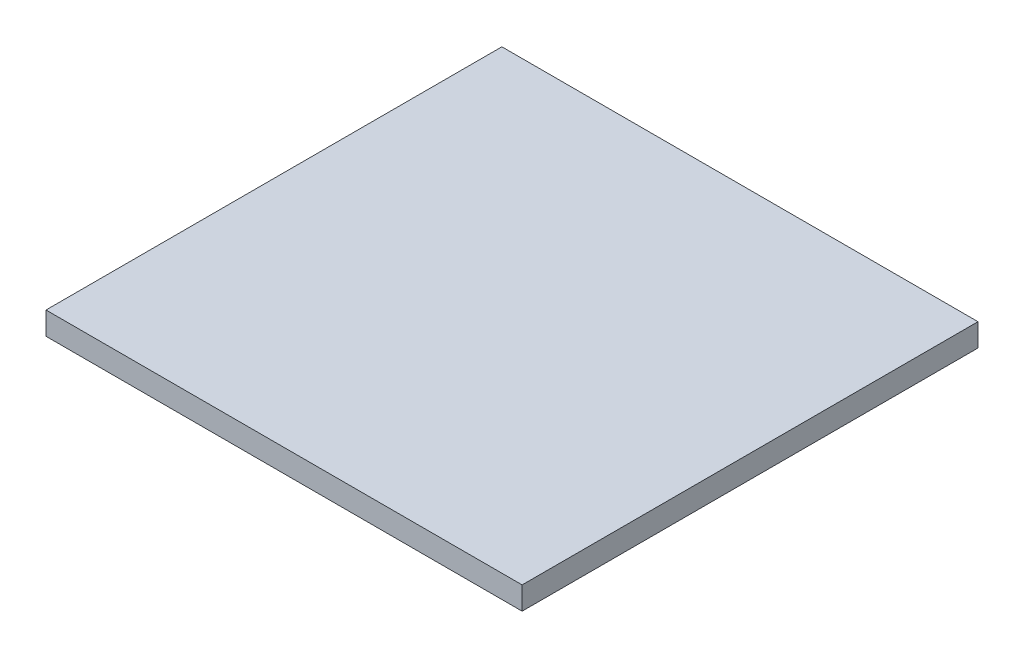
ISO-10303-21;
HEADER;
FILE_DESCRIPTION(('STEP AP214'),'2;1');
FILE_NAME('part.step','',(''),(''),'','','');
FILE_SCHEMA(('AUTOMOTIVE_DESIGN { 1 0 10303 214 1 1 1 1 }'));
ENDSEC;
DATA;
#1=APPLICATION_CONTEXT('core data for automotive mechanical design processes');
#2=APPLICATION_PROTOCOL_DEFINITION('international standard','automotive_design',2000,#1);
#3=PRODUCT_CONTEXT('',#1,'mechanical');
#4=PRODUCT('Part','Part','',(#3));
#5=PRODUCT_RELATED_PRODUCT_CATEGORY('part','',(#4));
#6=PRODUCT_DEFINITION_FORMATION('','',#4);
#7=PRODUCT_DEFINITION_CONTEXT('part definition',#1,'design');
#8=PRODUCT_DEFINITION('design','',#6,#7);
#9=PRODUCT_DEFINITION_SHAPE('','',#8);
#10=(LENGTH_UNIT() NAMED_UNIT(*) SI_UNIT(.MILLI.,.METRE.));
#11=(NAMED_UNIT(*) PLANE_ANGLE_UNIT() SI_UNIT($,.RADIAN.));
#12=(NAMED_UNIT(*) SI_UNIT($,.STERADIAN.) SOLID_ANGLE_UNIT());
#13=UNCERTAINTY_MEASURE_WITH_UNIT(LENGTH_MEASURE(1.E-05),#10,'distance_accuracy_value','');
#14=(GEOMETRIC_REPRESENTATION_CONTEXT(3) GLOBAL_UNCERTAINTY_ASSIGNED_CONTEXT((#13)) GLOBAL_UNIT_ASSIGNED_CONTEXT((#10,
#11,#12)) REPRESENTATION_CONTEXT('',''));
#15=CARTESIAN_POINT('',(0.,0.,0.));
#16=DIRECTION('',(0.,0.,1.));
#17=DIRECTION('',(1.,0.,0.));
#18=AXIS2_PLACEMENT_3D('',#15,#16,#17);
#19=CARTESIAN_POINT('',(188.,18.,-180.));
#20=DIRECTION('',(-1.,0.,0.));
#21=DIRECTION('',(0.,0.,1.));
#22=AXIS2_PLACEMENT_3D('',#19,#20,#21);
#23=PLANE('',#22);
#24=DIRECTION('',(0.,0.,-1.));
#25=VECTOR('',#24,1.);
#26=CARTESIAN_POINT('',(188.,0.,-180.));
#27=LINE('',#26,#25);
#28=CARTESIAN_POINT('',(188.,0.,180.));
#29=VERTEX_POINT('',#28);
#30=CARTESIAN_POINT('',(188.,0.,-180.));
#31=VERTEX_POINT('',#30);
#32=EDGE_CURVE('E95',#29,#31,#27,.T.);
#33=ORIENTED_EDGE('',*,*,#32,.T.);
#34=DIRECTION('',(0.,-1.,0.));
#35=VECTOR('',#34,1.);
#36=CARTESIAN_POINT('',(188.,18.,-180.));
#37=LINE('',#36,#35);
#38=CARTESIAN_POINT('',(188.,18.,-180.));
#39=VERTEX_POINT('',#38);
#40=EDGE_CURVE('E11',#39,#31,#37,.T.);
#41=ORIENTED_EDGE('',*,*,#40,.F.);
#42=DIRECTION('',(0.,0.,-1.));
#43=VECTOR('',#42,1.);
#44=CARTESIAN_POINT('',(188.,18.,-180.));
#45=LINE('',#44,#43);
#46=CARTESIAN_POINT('',(188.,18.,180.));
#47=VERTEX_POINT('',#46);
#48=EDGE_CURVE('E83',#47,#39,#45,.T.);
#49=ORIENTED_EDGE('',*,*,#48,.F.);
#50=DIRECTION('',(0.,-1.,0.));
#51=VECTOR('',#50,1.);
#52=CARTESIAN_POINT('',(188.,18.,180.));
#53=LINE('',#52,#51);
#54=EDGE_CURVE('E91',#47,#29,#53,.T.);
#55=ORIENTED_EDGE('',*,*,#54,.T.);
#56=EDGE_LOOP('',(#33,#41,#49,#55));
#57=FACE_BOUND('',#56,.T.);
#58=ADVANCED_FACE('F32',(#57),#23,.F.);
#59=CARTESIAN_POINT('',(-188.,18.,-180.));
#60=DIRECTION('',(0.,0.,1.));
#61=DIRECTION('',(1.,0.,0.));
#62=AXIS2_PLACEMENT_3D('',#59,#60,#61);
#63=PLANE('',#62);
#64=DIRECTION('',(-1.,0.,0.));
#65=VECTOR('',#64,1.);
#66=CARTESIAN_POINT('',(-188.,0.,-180.));
#67=LINE('',#66,#65);
#68=CARTESIAN_POINT('',(-188.,0.,-180.));
#69=VERTEX_POINT('',#68);
#70=EDGE_CURVE('E87',#31,#69,#67,.T.);
#71=ORIENTED_EDGE('',*,*,#70,.T.);
#72=DIRECTION('',(0.,-1.,0.));
#73=VECTOR('',#72,1.);
#74=CARTESIAN_POINT('',(-188.,18.,-180.));
#75=LINE('',#74,#73);
#76=CARTESIAN_POINT('',(-188.,18.,-180.));
#77=VERTEX_POINT('',#76);
#78=EDGE_CURVE('E40',#77,#69,#75,.T.);
#79=ORIENTED_EDGE('',*,*,#78,.F.);
#80=DIRECTION('',(-1.,0.,0.));
#81=VECTOR('',#80,1.);
#82=CARTESIAN_POINT('',(-188.,18.,-180.));
#83=LINE('',#82,#81);
#84=EDGE_CURVE('E78',#39,#77,#83,.T.);
#85=ORIENTED_EDGE('',*,*,#84,.F.);
#86=ORIENTED_EDGE('',*,*,#40,.T.);
#87=EDGE_LOOP('',(#71,#79,#85,#86));
#88=FACE_BOUND('',#87,.T.);
#89=ADVANCED_FACE('F86',(#88),#63,.F.);
#90=CARTESIAN_POINT('',(-188.,18.,-180.));
#91=DIRECTION('',(1.,0.,0.));
#92=DIRECTION('',(0.,0.,-1.));
#93=AXIS2_PLACEMENT_3D('',#90,#91,#92);
#94=PLANE('',#93);
#95=DIRECTION('',(0.,0.,1.));
#96=VECTOR('',#95,1.);
#97=CARTESIAN_POINT('',(-188.,0.,-180.));
#98=LINE('',#97,#96);
#99=CARTESIAN_POINT('',(-188.,0.,180.));
#100=VERTEX_POINT('',#99);
#101=EDGE_CURVE('E65',#69,#100,#98,.T.);
#102=ORIENTED_EDGE('',*,*,#101,.T.);
#103=DIRECTION('',(0.,-1.,0.));
#104=VECTOR('',#103,1.);
#105=CARTESIAN_POINT('',(-188.,18.,180.));
#106=LINE('',#105,#104);
#107=CARTESIAN_POINT('',(-188.,18.,180.));
#108=VERTEX_POINT('',#107);
#109=EDGE_CURVE('E88',#108,#100,#106,.T.);
#110=ORIENTED_EDGE('',*,*,#109,.F.);
#111=DIRECTION('',(0.,0.,1.));
#112=VECTOR('',#111,1.);
#113=CARTESIAN_POINT('',(-188.,18.,-180.));
#114=LINE('',#113,#112);
#115=EDGE_CURVE('E81',#77,#108,#114,.T.);
#116=ORIENTED_EDGE('',*,*,#115,.F.);
#117=ORIENTED_EDGE('',*,*,#78,.T.);
#118=EDGE_LOOP('',(#102,#110,#116,#117));
#119=FACE_BOUND('',#118,.T.);
#120=ADVANCED_FACE('F89',(#119),#94,.F.);
#121=CARTESIAN_POINT('',(-188.,18.,180.));
#122=DIRECTION('',(0.,0.,-1.));
#123=DIRECTION('',(-1.,0.,0.));
#124=AXIS2_PLACEMENT_3D('',#121,#122,#123);
#125=PLANE('',#124);
#126=DIRECTION('',(1.,0.,0.));
#127=VECTOR('',#126,1.);
#128=CARTESIAN_POINT('',(-188.,0.,180.));
#129=LINE('',#128,#127);
#130=EDGE_CURVE('E71',#100,#29,#129,.T.);
#131=ORIENTED_EDGE('',*,*,#130,.T.);
#132=ORIENTED_EDGE('',*,*,#54,.F.);
#133=DIRECTION('',(1.,0.,0.));
#134=VECTOR('',#133,1.);
#135=CARTESIAN_POINT('',(-188.,18.,180.));
#136=LINE('',#135,#134);
#137=EDGE_CURVE('E48',#108,#47,#136,.T.);
#138=ORIENTED_EDGE('',*,*,#137,.F.);
#139=ORIENTED_EDGE('',*,*,#109,.T.);
#140=EDGE_LOOP('',(#131,#132,#138,#139));
#141=FACE_BOUND('',#140,.T.);
#142=ADVANCED_FACE('F102',(#141),#125,.F.);
#143=CARTESIAN_POINT('',(0.,18.,0.));
#144=DIRECTION('',(0.,1.,0.));
#145=DIRECTION('',(0.,0.,1.));
#146=AXIS2_PLACEMENT_3D('',#143,#144,#145);
#147=PLANE('',#146);
#148=ORIENTED_EDGE('',*,*,#48,.T.);
#149=ORIENTED_EDGE('',*,*,#84,.T.);
#150=ORIENTED_EDGE('',*,*,#115,.T.);
#151=ORIENTED_EDGE('',*,*,#137,.T.);
#152=EDGE_LOOP('',(#148,#149,#150,#151));
#153=FACE_BOUND('',#152,.T.);
#154=ADVANCED_FACE('F79',(#153),#147,.T.);
#155=CARTESIAN_POINT('',(0.,0.,0.));
#156=DIRECTION('',(0.,1.,0.));
#157=DIRECTION('',(0.,0.,1.));
#158=AXIS2_PLACEMENT_3D('',#155,#156,#157);
#159=PLANE('',#158);
#160=ORIENTED_EDGE('',*,*,#32,.F.);
#161=ORIENTED_EDGE('',*,*,#130,.F.);
#162=ORIENTED_EDGE('',*,*,#101,.F.);
#163=ORIENTED_EDGE('',*,*,#70,.F.);
#164=EDGE_LOOP('',(#160,#161,#162,#163));
#165=FACE_BOUND('',#164,.T.);
#166=ADVANCED_FACE('F105',(#165),#159,.F.);
#167=CLOSED_SHELL('',(#58,#89,#120,#142,#154,#166));
#168=MANIFOLD_SOLID_BREP('B2',#167);
#169=ADVANCED_BREP_SHAPE_REPRESENTATION('',(#18,#168),#14);
#170=SHAPE_DEFINITION_REPRESENTATION(#9,#169);
ENDSEC;
END-ISO-10303-21;
